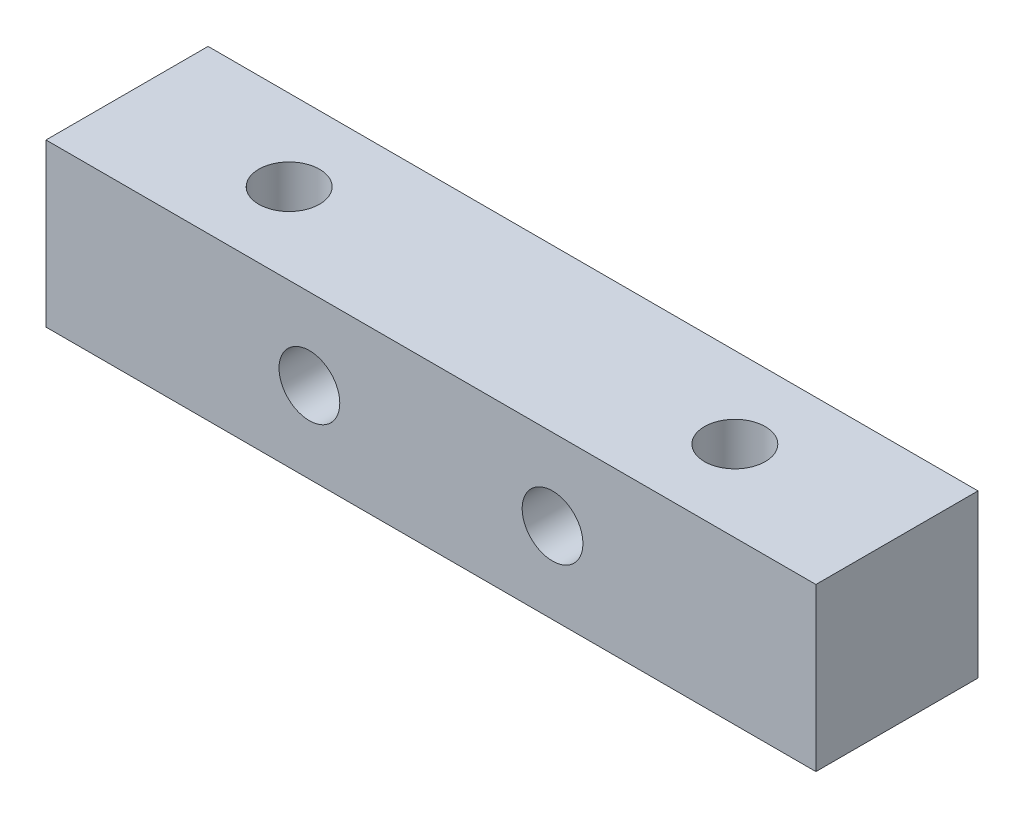
ISO-10303-21;
HEADER;
FILE_DESCRIPTION(('STEP AP214'),'2;1');
FILE_NAME('part.step','',(''),(''),'','','');
FILE_SCHEMA(('AUTOMOTIVE_DESIGN { 1 0 10303 214 1 1 1 1 }'));
ENDSEC;
DATA;
#1=APPLICATION_CONTEXT('core data for automotive mechanical design processes');
#2=APPLICATION_PROTOCOL_DEFINITION('international standard','automotive_design',2000,#1);
#3=PRODUCT_CONTEXT('',#1,'mechanical');
#4=PRODUCT('Part','Part','',(#3));
#5=PRODUCT_RELATED_PRODUCT_CATEGORY('part','',(#4));
#6=PRODUCT_DEFINITION_FORMATION('','',#4);
#7=PRODUCT_DEFINITION_CONTEXT('part definition',#1,'design');
#8=PRODUCT_DEFINITION('design','',#6,#7);
#9=PRODUCT_DEFINITION_SHAPE('','',#8);
#10=(LENGTH_UNIT() NAMED_UNIT(*) SI_UNIT(.MILLI.,.METRE.));
#11=(NAMED_UNIT(*) PLANE_ANGLE_UNIT() SI_UNIT($,.RADIAN.));
#12=(NAMED_UNIT(*) SI_UNIT($,.STERADIAN.) SOLID_ANGLE_UNIT());
#13=UNCERTAINTY_MEASURE_WITH_UNIT(LENGTH_MEASURE(1.E-05),#10,'distance_accuracy_value','');
#14=(GEOMETRIC_REPRESENTATION_CONTEXT(3) GLOBAL_UNCERTAINTY_ASSIGNED_CONTEXT((#13)) GLOBAL_UNIT_ASSIGNED_CONTEXT((#10,
#11,#12)) REPRESENTATION_CONTEXT('',''));
#15=CARTESIAN_POINT('',(0.,0.,0.));
#16=DIRECTION('',(0.,0.,1.));
#17=DIRECTION('',(1.,0.,0.));
#18=AXIS2_PLACEMENT_3D('',#15,#16,#17);
#19=CARTESIAN_POINT('',(0.,8.,0.));
#20=DIRECTION('',(0.,-1.,0.));
#21=DIRECTION('',(0.,0.,-1.));
#22=AXIS2_PLACEMENT_3D('',#19,#20,#21);
#23=PLANE('',#22);
#24=DIRECTION('',(0.,0.,-1.));
#25=VECTOR('',#24,1.);
#26=CARTESIAN_POINT('',(19.,8.,4.));
#27=LINE('',#26,#25);
#28=CARTESIAN_POINT('',(19.,8.,4.));
#29=VERTEX_POINT('',#28);
#30=CARTESIAN_POINT('',(19.,8.,-4.));
#31=VERTEX_POINT('',#30);
#32=EDGE_CURVE('E92',#29,#31,#27,.T.);
#33=ORIENTED_EDGE('',*,*,#32,.T.);
#34=DIRECTION('',(-1.,0.,0.));
#35=VECTOR('',#34,1.);
#36=CARTESIAN_POINT('',(-19.,8.,-4.));
#37=LINE('',#36,#35);
#38=CARTESIAN_POINT('',(-19.,8.,-4.));
#39=VERTEX_POINT('',#38);
#40=EDGE_CURVE('E87',#31,#39,#37,.T.);
#41=ORIENTED_EDGE('',*,*,#40,.T.);
#42=DIRECTION('',(0.,0.,1.));
#43=VECTOR('',#42,1.);
#44=CARTESIAN_POINT('',(-19.,8.,4.));
#45=LINE('',#44,#43);
#46=CARTESIAN_POINT('',(-19.,8.,4.));
#47=VERTEX_POINT('',#46);
#48=EDGE_CURVE('E90',#39,#47,#45,.T.);
#49=ORIENTED_EDGE('',*,*,#48,.T.);
#50=DIRECTION('',(1.,0.,0.));
#51=VECTOR('',#50,1.);
#52=CARTESIAN_POINT('',(-19.,8.,4.));
#53=LINE('',#52,#51);
#54=EDGE_CURVE('E57',#47,#29,#53,.T.);
#55=ORIENTED_EDGE('',*,*,#54,.T.);
#56=EDGE_LOOP('',(#33,#41,#49,#55));
#57=FACE_BOUND('',#56,.T.);
#58=CARTESIAN_POINT('',(-11.,8.,0.));
#59=DIRECTION('',(0.,1.,0.));
#60=DIRECTION('',(0.,0.,1.));
#61=AXIS2_PLACEMENT_3D('',#58,#59,#60);
#62=CIRCLE('',#61,1.5);
#63=CARTESIAN_POINT('',(-11.,8.,1.5));
#64=VERTEX_POINT('',#63);
#65=EDGE_CURVE('E107',#64,#64,#62,.T.);
#66=ORIENTED_EDGE('',*,*,#65,.F.);
#67=EDGE_LOOP('',(#66));
#68=FACE_BOUND('',#67,.T.);
#69=CARTESIAN_POINT('',(11.,8.,0.));
#70=DIRECTION('',(0.,1.,0.));
#71=DIRECTION('',(0.,0.,1.));
#72=AXIS2_PLACEMENT_3D('',#69,#70,#71);
#73=CIRCLE('',#72,1.5);
#74=CARTESIAN_POINT('',(11.,8.,1.5));
#75=VERTEX_POINT('',#74);
#76=EDGE_CURVE('E122',#75,#75,#73,.T.);
#77=ORIENTED_EDGE('',*,*,#76,.F.);
#78=EDGE_LOOP('',(#77));
#79=FACE_BOUND('',#78,.T.);
#80=ADVANCED_FACE('F40',(#57,#68,#79),#23,.F.);
#81=CARTESIAN_POINT('',(0.,0.,0.));
#82=DIRECTION('',(0.,-1.,0.));
#83=DIRECTION('',(0.,0.,-1.));
#84=AXIS2_PLACEMENT_3D('',#81,#82,#83);
#85=PLANE('',#84);
#86=CARTESIAN_POINT('',(-11.,0.,0.));
#87=DIRECTION('',(0.,1.,0.));
#88=DIRECTION('',(0.,0.,1.));
#89=AXIS2_PLACEMENT_3D('',#86,#87,#88);
#90=CIRCLE('',#89,1.5);
#91=CARTESIAN_POINT('',(-11.,0.,1.5));
#92=VERTEX_POINT('',#91);
#93=EDGE_CURVE('E119',#92,#92,#90,.T.);
#94=ORIENTED_EDGE('',*,*,#93,.T.);
#95=EDGE_LOOP('',(#94));
#96=FACE_BOUND('',#95,.T.);
#97=DIRECTION('',(0.,0.,-1.));
#98=VECTOR('',#97,1.);
#99=CARTESIAN_POINT('',(19.,0.,4.));
#100=LINE('',#99,#98);
#101=CARTESIAN_POINT('',(19.,0.,4.));
#102=VERTEX_POINT('',#101);
#103=CARTESIAN_POINT('',(19.,0.,-4.));
#104=VERTEX_POINT('',#103);
#105=EDGE_CURVE('E104',#102,#104,#100,.T.);
#106=ORIENTED_EDGE('',*,*,#105,.F.);
#107=DIRECTION('',(1.,0.,0.));
#108=VECTOR('',#107,1.);
#109=CARTESIAN_POINT('',(-19.,0.,4.));
#110=LINE('',#109,#108);
#111=CARTESIAN_POINT('',(-19.,0.,4.));
#112=VERTEX_POINT('',#111);
#113=EDGE_CURVE('E80',#112,#102,#110,.T.);
#114=ORIENTED_EDGE('',*,*,#113,.F.);
#115=DIRECTION('',(0.,0.,1.));
#116=VECTOR('',#115,1.);
#117=CARTESIAN_POINT('',(-19.,0.,4.));
#118=LINE('',#117,#116);
#119=CARTESIAN_POINT('',(-19.,0.,-4.));
#120=VERTEX_POINT('',#119);
#121=EDGE_CURVE('E74',#120,#112,#118,.T.);
#122=ORIENTED_EDGE('',*,*,#121,.F.);
#123=DIRECTION('',(-1.,0.,0.));
#124=VECTOR('',#123,1.);
#125=CARTESIAN_POINT('',(-19.,0.,-4.));
#126=LINE('',#125,#124);
#127=EDGE_CURVE('E96',#104,#120,#126,.T.);
#128=ORIENTED_EDGE('',*,*,#127,.F.);
#129=EDGE_LOOP('',(#106,#114,#122,#128));
#130=FACE_BOUND('',#129,.T.);
#131=CARTESIAN_POINT('',(11.,0.,0.));
#132=DIRECTION('',(0.,1.,0.));
#133=DIRECTION('',(0.,0.,1.));
#134=AXIS2_PLACEMENT_3D('',#131,#132,#133);
#135=CIRCLE('',#134,1.5);
#136=CARTESIAN_POINT('',(11.,0.,1.5));
#137=VERTEX_POINT('',#136);
#138=EDGE_CURVE('E125',#137,#137,#135,.T.);
#139=ORIENTED_EDGE('',*,*,#138,.T.);
#140=EDGE_LOOP('',(#139));
#141=FACE_BOUND('',#140,.T.);
#142=ADVANCED_FACE('F115',(#96,#130,#141),#85,.T.);
#143=CARTESIAN_POINT('',(19.,8.,4.));
#144=DIRECTION('',(-1.,0.,0.));
#145=DIRECTION('',(0.,0.,1.));
#146=AXIS2_PLACEMENT_3D('',#143,#144,#145);
#147=PLANE('',#146);
#148=ORIENTED_EDGE('',*,*,#105,.T.);
#149=DIRECTION('',(0.,-1.,0.));
#150=VECTOR('',#149,1.);
#151=CARTESIAN_POINT('',(19.,8.,-4.));
#152=LINE('',#151,#150);
#153=EDGE_CURVE('E11',#31,#104,#152,.T.);
#154=ORIENTED_EDGE('',*,*,#153,.F.);
#155=ORIENTED_EDGE('',*,*,#32,.F.);
#156=DIRECTION('',(0.,-1.,0.));
#157=VECTOR('',#156,1.);
#158=CARTESIAN_POINT('',(19.,8.,4.));
#159=LINE('',#158,#157);
#160=EDGE_CURVE('E100',#29,#102,#159,.T.);
#161=ORIENTED_EDGE('',*,*,#160,.T.);
#162=EDGE_LOOP('',(#148,#154,#155,#161));
#163=FACE_BOUND('',#162,.T.);
#164=ADVANCED_FACE('F42',(#163),#147,.F.);
#165=CARTESIAN_POINT('',(-19.,8.,-4.));
#166=DIRECTION('',(0.,0.,1.));
#167=DIRECTION('',(1.,0.,0.));
#168=AXIS2_PLACEMENT_3D('',#165,#166,#167);
#169=PLANE('',#168);
#170=CARTESIAN_POINT('',(-6.,4.,-4.));
#171=DIRECTION('',(0.,0.,1.));
#172=DIRECTION('',(1.,0.,0.));
#173=AXIS2_PLACEMENT_3D('',#170,#171,#172);
#174=CIRCLE('',#173,1.5);
#175=CARTESIAN_POINT('',(-4.5,4.,-4.));
#176=VERTEX_POINT('',#175);
#177=EDGE_CURVE('E128',#176,#176,#174,.T.);
#178=ORIENTED_EDGE('',*,*,#177,.T.);
#179=EDGE_LOOP('',(#178));
#180=FACE_BOUND('',#179,.T.);
#181=CARTESIAN_POINT('',(6.,4.,-4.));
#182=DIRECTION('',(0.,0.,1.));
#183=DIRECTION('',(-1.,0.,0.));
#184=AXIS2_PLACEMENT_3D('',#181,#182,#183);
#185=CIRCLE('',#184,1.5);
#186=CARTESIAN_POINT('',(4.5,4.,-4.));
#187=VERTEX_POINT('',#186);
#188=EDGE_CURVE('E131',#187,#187,#185,.T.);
#189=ORIENTED_EDGE('',*,*,#188,.T.);
#190=EDGE_LOOP('',(#189));
#191=FACE_BOUND('',#190,.T.);
#192=ORIENTED_EDGE('',*,*,#127,.T.);
#193=DIRECTION('',(0.,-1.,0.));
#194=VECTOR('',#193,1.);
#195=CARTESIAN_POINT('',(-19.,8.,-4.));
#196=LINE('',#195,#194);
#197=EDGE_CURVE('E49',#39,#120,#196,.T.);
#198=ORIENTED_EDGE('',*,*,#197,.F.);
#199=ORIENTED_EDGE('',*,*,#40,.F.);
#200=ORIENTED_EDGE('',*,*,#153,.T.);
#201=EDGE_LOOP('',(#192,#198,#199,#200));
#202=FACE_BOUND('',#201,.T.);
#203=ADVANCED_FACE('F95',(#180,#191,#202),#169,.F.);
#204=CARTESIAN_POINT('',(-19.,8.,4.));
#205=DIRECTION('',(1.,0.,0.));
#206=DIRECTION('',(0.,0.,-1.));
#207=AXIS2_PLACEMENT_3D('',#204,#205,#206);
#208=PLANE('',#207);
#209=ORIENTED_EDGE('',*,*,#121,.T.);
#210=DIRECTION('',(0.,-1.,0.));
#211=VECTOR('',#210,1.);
#212=CARTESIAN_POINT('',(-19.,8.,4.));
#213=LINE('',#212,#211);
#214=EDGE_CURVE('E97',#47,#112,#213,.T.);
#215=ORIENTED_EDGE('',*,*,#214,.F.);
#216=ORIENTED_EDGE('',*,*,#48,.F.);
#217=ORIENTED_EDGE('',*,*,#197,.T.);
#218=EDGE_LOOP('',(#209,#215,#216,#217));
#219=FACE_BOUND('',#218,.T.);
#220=ADVANCED_FACE('F98',(#219),#208,.F.);
#221=CARTESIAN_POINT('',(-19.,8.,4.));
#222=DIRECTION('',(0.,0.,-1.));
#223=DIRECTION('',(-1.,0.,0.));
#224=AXIS2_PLACEMENT_3D('',#221,#222,#223);
#225=PLANE('',#224);
#226=CARTESIAN_POINT('',(-6.,4.,4.));
#227=DIRECTION('',(0.,0.,1.));
#228=DIRECTION('',(1.,0.,0.));
#229=AXIS2_PLACEMENT_3D('',#226,#227,#228);
#230=CIRCLE('',#229,1.5);
#231=CARTESIAN_POINT('',(-4.5,4.,4.));
#232=VERTEX_POINT('',#231);
#233=EDGE_CURVE('E137',#232,#232,#230,.T.);
#234=ORIENTED_EDGE('',*,*,#233,.F.);
#235=EDGE_LOOP('',(#234));
#236=FACE_BOUND('',#235,.T.);
#237=CARTESIAN_POINT('',(6.,4.,4.));
#238=DIRECTION('',(0.,0.,1.));
#239=DIRECTION('',(-1.,0.,0.));
#240=AXIS2_PLACEMENT_3D('',#237,#238,#239);
#241=CIRCLE('',#240,1.5);
#242=CARTESIAN_POINT('',(4.5,4.,4.));
#243=VERTEX_POINT('',#242);
#244=EDGE_CURVE('E134',#243,#243,#241,.T.);
#245=ORIENTED_EDGE('',*,*,#244,.F.);
#246=EDGE_LOOP('',(#245));
#247=FACE_BOUND('',#246,.T.);
#248=ORIENTED_EDGE('',*,*,#113,.T.);
#249=ORIENTED_EDGE('',*,*,#160,.F.);
#250=ORIENTED_EDGE('',*,*,#54,.F.);
#251=ORIENTED_EDGE('',*,*,#214,.T.);
#252=EDGE_LOOP('',(#248,#249,#250,#251));
#253=FACE_BOUND('',#252,.T.);
#254=ADVANCED_FACE('F112',(#236,#247,#253),#225,.F.);
#255=CARTESIAN_POINT('',(-11.,8.,0.));
#256=DIRECTION('',(0.,-1.,0.));
#257=DIRECTION('',(0.,0.,-1.));
#258=AXIS2_PLACEMENT_3D('',#255,#256,#257);
#259=CYLINDRICAL_SURFACE('',#258,1.5);
#260=ORIENTED_EDGE('',*,*,#65,.T.);
#261=EDGE_LOOP('',(#260));
#262=FACE_BOUND('',#261,.T.);
#263=ORIENTED_EDGE('',*,*,#93,.F.);
#264=EDGE_LOOP('',(#263));
#265=FACE_BOUND('',#264,.T.);
#266=ADVANCED_FACE('F154',(#262,#265),#259,.F.);
#267=CARTESIAN_POINT('',(11.,8.,0.));
#268=DIRECTION('',(0.,-1.,0.));
#269=DIRECTION('',(0.,0.,-1.));
#270=AXIS2_PLACEMENT_3D('',#267,#268,#269);
#271=CYLINDRICAL_SURFACE('',#270,1.5);
#272=ORIENTED_EDGE('',*,*,#76,.T.);
#273=EDGE_LOOP('',(#272));
#274=FACE_BOUND('',#273,.T.);
#275=ORIENTED_EDGE('',*,*,#138,.F.);
#276=EDGE_LOOP('',(#275));
#277=FACE_BOUND('',#276,.T.);
#278=ADVANCED_FACE('F159',(#274,#277),#271,.F.);
#279=CARTESIAN_POINT('',(6.,4.,-4.));
#280=DIRECTION('',(0.,0.,1.));
#281=DIRECTION('',(1.,0.,0.));
#282=AXIS2_PLACEMENT_3D('',#279,#280,#281);
#283=CYLINDRICAL_SURFACE('',#282,1.5);
#284=ORIENTED_EDGE('',*,*,#188,.F.);
#285=EDGE_LOOP('',(#284));
#286=FACE_BOUND('',#285,.T.);
#287=ORIENTED_EDGE('',*,*,#244,.T.);
#288=EDGE_LOOP('',(#287));
#289=FACE_BOUND('',#288,.T.);
#290=ADVANCED_FACE('F148',(#286,#289),#283,.F.);
#291=CARTESIAN_POINT('',(-6.,4.,-4.));
#292=DIRECTION('',(0.,0.,1.));
#293=DIRECTION('',(1.,0.,0.));
#294=AXIS2_PLACEMENT_3D('',#291,#292,#293);
#295=CYLINDRICAL_SURFACE('',#294,1.5);
#296=ORIENTED_EDGE('',*,*,#177,.F.);
#297=EDGE_LOOP('',(#296));
#298=FACE_BOUND('',#297,.T.);
#299=ORIENTED_EDGE('',*,*,#233,.T.);
#300=EDGE_LOOP('',(#299));
#301=FACE_BOUND('',#300,.T.);
#302=ADVANCED_FACE('F145',(#298,#301),#295,.F.);
#303=CLOSED_SHELL('',(#80,#142,#164,#203,#220,#254,#266,#278,#290,#302));
#304=MANIFOLD_SOLID_BREP('B2',#303);
#305=ADVANCED_BREP_SHAPE_REPRESENTATION('',(#18,#304),#14);
#306=SHAPE_DEFINITION_REPRESENTATION(#9,#305);
ENDSEC;
END-ISO-10303-21;
